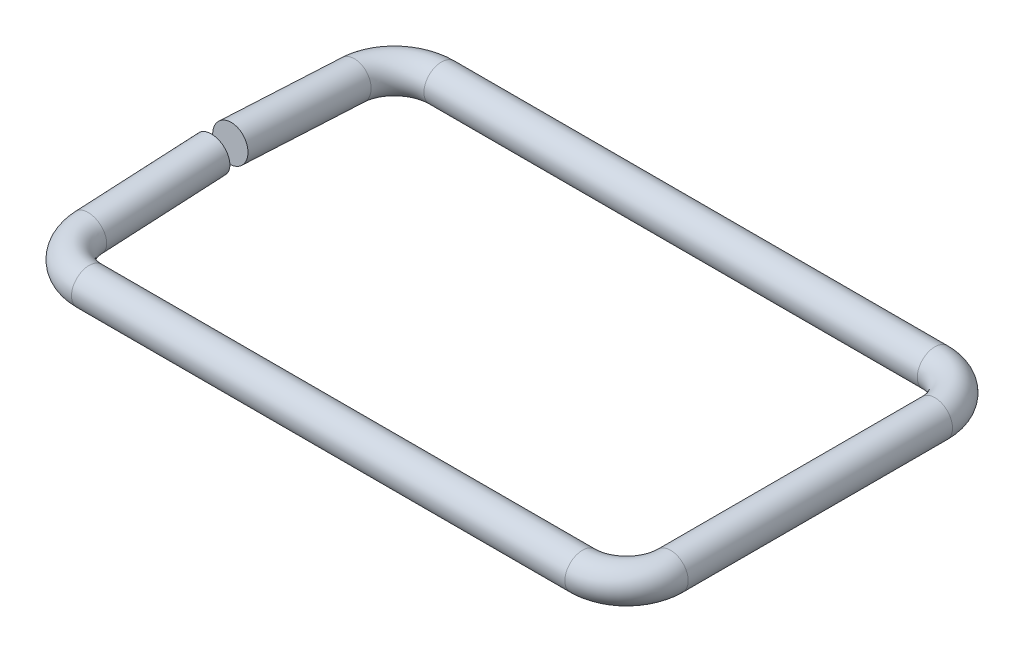
ISO-10303-21;
HEADER;
FILE_DESCRIPTION(('STEP AP214'),'2;1');
FILE_NAME('part.step','',(''),(''),'','','');
FILE_SCHEMA(('AUTOMOTIVE_DESIGN { 1 0 10303 214 1 1 1 1 }'));
ENDSEC;
DATA;
#1=APPLICATION_CONTEXT('core data for automotive mechanical design processes');
#2=APPLICATION_PROTOCOL_DEFINITION('international standard','automotive_design',2000,#1);
#3=PRODUCT_CONTEXT('',#1,'mechanical');
#4=PRODUCT('Part','Part','',(#3));
#5=PRODUCT_RELATED_PRODUCT_CATEGORY('part','',(#4));
#6=PRODUCT_DEFINITION_FORMATION('','',#4);
#7=PRODUCT_DEFINITION_CONTEXT('part definition',#1,'design');
#8=PRODUCT_DEFINITION('design','',#6,#7);
#9=PRODUCT_DEFINITION_SHAPE('','',#8);
#10=(LENGTH_UNIT() NAMED_UNIT(*) SI_UNIT(.MILLI.,.METRE.));
#11=(NAMED_UNIT(*) PLANE_ANGLE_UNIT() SI_UNIT($,.RADIAN.));
#12=(NAMED_UNIT(*) SI_UNIT($,.STERADIAN.) SOLID_ANGLE_UNIT());
#13=UNCERTAINTY_MEASURE_WITH_UNIT(LENGTH_MEASURE(1.E-05),#10,'distance_accuracy_value','');
#14=(GEOMETRIC_REPRESENTATION_CONTEXT(3) GLOBAL_UNCERTAINTY_ASSIGNED_CONTEXT((#13)) GLOBAL_UNIT_ASSIGNED_CONTEXT((#10,
#11,#12)) REPRESENTATION_CONTEXT('',''));
#15=CARTESIAN_POINT('',(0.,0.,0.));
#16=DIRECTION('',(0.,0.,1.));
#17=DIRECTION('',(1.,0.,0.));
#18=AXIS2_PLACEMENT_3D('',#15,#16,#17);
#19=CARTESIAN_POINT('',(0.0262462701726474,7.53785143868254,-0.426118146143166));
#20=DIRECTION('',(0.,-0.0523359562429429,0.998629534754574));
#21=DIRECTION('',(0.,-0.998629534754574,-0.0523359562429429));
#22=AXIS2_PLACEMENT_3D('',#19,#20,#21);
#23=PLANE('',#22);
#24=CARTESIAN_POINT('',(-1.09456076458886,5.83445913904258,-0.515389153815147));
#25=DIRECTION('',(0.,0.0523359562429247,-0.998629534754575));
#26=DIRECTION('',(0.,0.998629534754575,0.0523359562429247));
#27=AXIS2_PLACEMENT_3D('',#24,#25,#26);
#28=CIRCLE('',#27,0.999999999999988);
#29=CARTESIAN_POINT('',(-1.09456076458886,6.83308867379714,-0.463053197572223));
#30=VERTEX_POINT('',#29);
#31=EDGE_CURVE('E18',#30,#30,#28,.F.);
#32=ORIENTED_EDGE('',*,*,#31,.F.);
#33=EDGE_LOOP('',(#32));
#34=FACE_BOUND('',#33,.T.);
#35=ADVANCED_FACE('F15',(#34),#23,.F.);
#36=CARTESIAN_POINT('',(-1.09456076458894,5.4681074453421,6.47501758946693));
#37=DIRECTION('',(0.,0.0523359562429247,-0.998629534754575));
#38=DIRECTION('',(0.,0.998629534754575,0.0523359562429247));
#39=AXIS2_PLACEMENT_3D('',#36,#37,#38);
#40=CYLINDRICAL_SURFACE('',#39,0.999999999999988);
#41=CARTESIAN_POINT('',(-1.09456076353115,5.46810744534044,6.47501758946776));
#42=DIRECTION('',(-2.88116225894218E-09,0.0523359562420164,-0.998629534754623));
#43=DIRECTION('',(-1.,-1.5050836271735E-10,2.8772284008452E-09));
#44=AXIS2_PLACEMENT_3D('',#41,#42,#43);
#45=CIRCLE('',#44,1.);
#46=CARTESIAN_POINT('',(-2.09456076353115,5.46810744518993,6.47501759234499));
#47=VERTEX_POINT('',#46);
#48=EDGE_CURVE('E89',#47,#47,#45,.F.);
#49=ORIENTED_EDGE('',*,*,#48,.F.);
#50=EDGE_LOOP('',(#49));
#51=FACE_BOUND('',#50,.T.);
#52=ORIENTED_EDGE('',*,*,#31,.T.);
#53=EDGE_LOOP('',(#52));
#54=FACE_BOUND('',#53,.T.);
#55=ADVANCED_FACE('F84',(#51,#54),#40,.T.);
#56=CARTESIAN_POINT('',(1.40543924367081,5.46810744571671,6.47501758227469));
#57=DIRECTION('',(-2.80680389921051E-13,-0.998629534754623,-0.0523359562420164));
#58=DIRECTION('',(0.,-0.0523359562420164,0.998629534754622));
#59=AXIS2_PLACEMENT_3D('',#56,#57,#58);
#60=TOROIDAL_SURFACE('',#59,2.50000000720196,1.);
#61=CARTESIAN_POINT('',(1.40543925034264,5.33726755473475,8.97159142635333));
#62=DIRECTION('',(-1.,0.,0.));
#63=DIRECTION('',(0.,0.,1.));
#64=AXIS2_PLACEMENT_3D('',#61,#62,#63);
#65=CIRCLE('',#64,1.);
#66=CARTESIAN_POINT('',(1.40543925034264,5.33726755473475,9.97159142635333));
#67=VERTEX_POINT('',#66);
#68=EDGE_CURVE('E92',#67,#67,#65,.F.);
#69=ORIENTED_EDGE('',*,*,#68,.F.);
#70=EDGE_LOOP('',(#69));
#71=FACE_BOUND('',#70,.T.);
#72=ORIENTED_EDGE('',*,*,#48,.T.);
#73=EDGE_LOOP('',(#72));
#74=FACE_BOUND('',#73,.T.);
#75=ADVANCED_FACE('F80',(#71,#74),#60,.T.);
#76=CARTESIAN_POINT('',(29.405439235411,5.33726755473475,8.97159142635333));
#77=DIRECTION('',(-1.,0.,0.));
#78=DIRECTION('',(0.,0.,1.));
#79=AXIS2_PLACEMENT_3D('',#76,#77,#78);
#80=CYLINDRICAL_SURFACE('',#79,1.);
#81=CARTESIAN_POINT('',(29.405439235411,5.33726755473475,8.97159142635397));
#82=DIRECTION('',(-1.,0.,0.));
#83=DIRECTION('',(0.,0.,1.));
#84=AXIS2_PLACEMENT_3D('',#81,#82,#83);
#85=CIRCLE('',#84,1.);
#86=CARTESIAN_POINT('',(29.405439235411,5.33726755473475,9.97159142635397));
#87=VERTEX_POINT('',#86);
#88=EDGE_CURVE('E65',#87,#87,#85,.F.);
#89=ORIENTED_EDGE('',*,*,#88,.F.);
#90=EDGE_LOOP('',(#89));
#91=FACE_BOUND('',#90,.T.);
#92=ORIENTED_EDGE('',*,*,#68,.T.);
#93=EDGE_LOOP('',(#92));
#94=FACE_BOUND('',#93,.T.);
#95=ADVANCED_FACE('F76',(#91,#94),#80,.T.);
#96=CARTESIAN_POINT('',(0.0262462701726474,7.53785143868254,-1.63069900115017));
#97=DIRECTION('',(0.,0.0523359562429429,0.998629534754574));
#98=DIRECTION('',(0.,-0.998629534754574,0.0523359562429429));
#99=AXIS2_PLACEMENT_3D('',#96,#97,#98);
#100=PLANE('',#99);
#101=CARTESIAN_POINT('',(-1.09456076458886,5.83445913904258,-1.54142799347818));
#102=DIRECTION('',(0.,0.0523359562429247,0.998629534754575));
#103=DIRECTION('',(0.,-0.998629534754575,0.0523359562429247));
#104=AXIS2_PLACEMENT_3D('',#101,#102,#103);
#105=CIRCLE('',#104,0.999999999999988);
#106=CARTESIAN_POINT('',(-1.09456076458886,4.83582960428801,-1.48909203723526));
#107=VERTEX_POINT('',#106);
#108=EDGE_CURVE('E60',#107,#107,#105,.F.);
#109=ORIENTED_EDGE('',*,*,#108,.F.);
#110=EDGE_LOOP('',(#109));
#111=FACE_BOUND('',#110,.T.);
#112=ADVANCED_FACE('F72',(#111),#100,.T.);
#113=CARTESIAN_POINT('',(29.405439235411,5.33726755473476,6.47159142635389));
#114=DIRECTION('',(0.,-1.,0.));
#115=DIRECTION('',(-1.,0.,0.));
#116=AXIS2_PLACEMENT_3D('',#113,#114,#115);
#117=TOROIDAL_SURFACE('',#116,2.50000000000008,1.);
#118=CARTESIAN_POINT('',(31.905439235411,5.33726755473474,6.47159142635333));
#119=DIRECTION('',(0.,0.,-1.));
#120=DIRECTION('',(-1.,0.,0.));
#121=AXIS2_PLACEMENT_3D('',#118,#119,#120);
#122=CIRCLE('',#121,1.);
#123=CARTESIAN_POINT('',(30.905439235411,5.33726755473474,6.47159142635333));
#124=VERTEX_POINT('',#123);
#125=EDGE_CURVE('E55',#124,#124,#122,.T.);
#126=ORIENTED_EDGE('',*,*,#125,.F.);
#127=EDGE_LOOP('',(#126));
#128=FACE_BOUND('',#127,.T.);
#129=ORIENTED_EDGE('',*,*,#88,.T.);
#130=EDGE_LOOP('',(#129));
#131=FACE_BOUND('',#130,.T.);
#132=ADVANCED_FACE('F68',(#128,#131),#117,.T.);
#133=CARTESIAN_POINT('',(-1.09456076458894,5.4681074453421,-8.53183473676027));
#134=DIRECTION('',(0.,0.0523359562429247,0.998629534754575));
#135=DIRECTION('',(0.,-0.998629534754575,0.0523359562429247));
#136=AXIS2_PLACEMENT_3D('',#133,#134,#135);
#137=CYLINDRICAL_SURFACE('',#136,0.999999999999988);
#138=CARTESIAN_POINT('',(-1.09456076353115,5.46810744534044,-8.53183473676109));
#139=DIRECTION('',(-2.88115737396087E-09,0.0523359562420164,0.998629534754623));
#140=DIRECTION('',(-1.,-1.50508105978275E-10,-2.87722352280279E-09));
#141=AXIS2_PLACEMENT_3D('',#138,#139,#140);
#142=CIRCLE('',#141,1.);
#143=CARTESIAN_POINT('',(-2.09456076353115,5.46810744518993,-8.53183473963831));
#144=VERTEX_POINT('',#143);
#145=EDGE_CURVE('E52',#144,#144,#142,.F.);
#146=ORIENTED_EDGE('',*,*,#145,.F.);
#147=EDGE_LOOP('',(#146));
#148=FACE_BOUND('',#147,.T.);
#149=ORIENTED_EDGE('',*,*,#108,.T.);
#150=EDGE_LOOP('',(#149));
#151=FACE_BOUND('',#150,.T.);
#152=ADVANCED_FACE('F71',(#148,#151),#137,.T.);
#153=CARTESIAN_POINT('',(31.905439235411,5.33726755473474,-1.02840857364667));
#154=DIRECTION('',(0.,0.,-1.));
#155=DIRECTION('',(-1.,0.,0.));
#156=AXIS2_PLACEMENT_3D('',#153,#154,#155);
#157=CYLINDRICAL_SURFACE('',#156,1.);
#158=CARTESIAN_POINT('',(31.9054392354111,5.33726755473475,-8.52840857364723));
#159=DIRECTION('',(0.,0.,-1.));
#160=DIRECTION('',(1.,0.,0.));
#161=AXIS2_PLACEMENT_3D('',#158,#159,#160);
#162=CIRCLE('',#161,1.);
#163=CARTESIAN_POINT('',(32.9054392354111,5.33726755473474,-8.52840857364723));
#164=VERTEX_POINT('',#163);
#165=EDGE_CURVE('E27',#164,#164,#162,.T.);
#166=ORIENTED_EDGE('',*,*,#165,.F.);
#167=EDGE_LOOP('',(#166));
#168=FACE_BOUND('',#167,.T.);
#169=ORIENTED_EDGE('',*,*,#125,.T.);
#170=EDGE_LOOP('',(#169));
#171=FACE_BOUND('',#170,.T.);
#172=ADVANCED_FACE('F46',(#168,#171),#157,.T.);
#173=CARTESIAN_POINT('',(1.40543924367081,5.46810744571671,-8.53183472956803));
#174=DIRECTION('',(2.80680389921051E-13,0.998629534754623,-0.0523359562420164));
#175=DIRECTION('',(0.,-0.0523359562420164,-0.998629534754622));
#176=AXIS2_PLACEMENT_3D('',#173,#174,#175);
#177=TOROIDAL_SURFACE('',#176,2.50000000720196,1.);
#178=CARTESIAN_POINT('',(1.40543925034252,5.33726755473475,-11.0284085736467));
#179=DIRECTION('',(-1.,0.,0.));
#180=DIRECTION('',(0.,0.,1.));
#181=AXIS2_PLACEMENT_3D('',#178,#179,#180);
#182=CIRCLE('',#181,1.);
#183=CARTESIAN_POINT('',(1.40543925034252,5.33726755473475,-10.0284085736467));
#184=VERTEX_POINT('',#183);
#185=EDGE_CURVE('E22',#184,#184,#182,.F.);
#186=ORIENTED_EDGE('',*,*,#185,.F.);
#187=EDGE_LOOP('',(#186));
#188=FACE_BOUND('',#187,.T.);
#189=ORIENTED_EDGE('',*,*,#145,.T.);
#190=EDGE_LOOP('',(#189));
#191=FACE_BOUND('',#190,.T.);
#192=ADVANCED_FACE('F41',(#188,#191),#177,.T.);
#193=CARTESIAN_POINT('',(29.405439235411,5.33726755473476,-8.52840857364723));
#194=DIRECTION('',(0.,1.,0.));
#195=DIRECTION('',(1.,0.,0.));
#196=AXIS2_PLACEMENT_3D('',#193,#194,#195);
#197=TOROIDAL_SURFACE('',#196,2.50000000000008,1.);
#198=ORIENTED_EDGE('',*,*,#165,.T.);
#199=EDGE_LOOP('',(#198));
#200=FACE_BOUND('',#199,.T.);
#201=CARTESIAN_POINT('',(29.405439235411,5.33726755473475,-11.0284085736467));
#202=DIRECTION('',(-1.,0.,0.));
#203=DIRECTION('',(0.,0.,1.));
#204=AXIS2_PLACEMENT_3D('',#201,#202,#203);
#205=CIRCLE('',#204,1.);
#206=CARTESIAN_POINT('',(29.405439235411,5.33726755473475,-10.0284085736467));
#207=VERTEX_POINT('',#206);
#208=EDGE_CURVE('E10',#207,#207,#205,.T.);
#209=ORIENTED_EDGE('',*,*,#208,.F.);
#210=EDGE_LOOP('',(#209));
#211=FACE_BOUND('',#210,.T.);
#212=ADVANCED_FACE('F36',(#200,#211),#197,.T.);
#213=CARTESIAN_POINT('',(29.405439235411,5.33726755473475,-11.0284085736467));
#214=DIRECTION('',(-1.,0.,0.));
#215=DIRECTION('',(0.,0.,1.));
#216=AXIS2_PLACEMENT_3D('',#213,#214,#215);
#217=CYLINDRICAL_SURFACE('',#216,1.);
#218=ORIENTED_EDGE('',*,*,#208,.T.);
#219=EDGE_LOOP('',(#218));
#220=FACE_BOUND('',#219,.T.);
#221=ORIENTED_EDGE('',*,*,#185,.T.);
#222=EDGE_LOOP('',(#221));
#223=FACE_BOUND('',#222,.T.);
#224=ADVANCED_FACE('F40',(#220,#223),#217,.T.);
#225=CLOSED_SHELL('',(#35,#55,#75,#95,#112,#132,#152,#172,#192,#212,#224));
#226=MANIFOLD_SOLID_BREP('B1',#225);
#227=ADVANCED_BREP_SHAPE_REPRESENTATION('',(#18,#226),#14);
#228=SHAPE_DEFINITION_REPRESENTATION(#9,#227);
ENDSEC;
END-ISO-10303-21;
